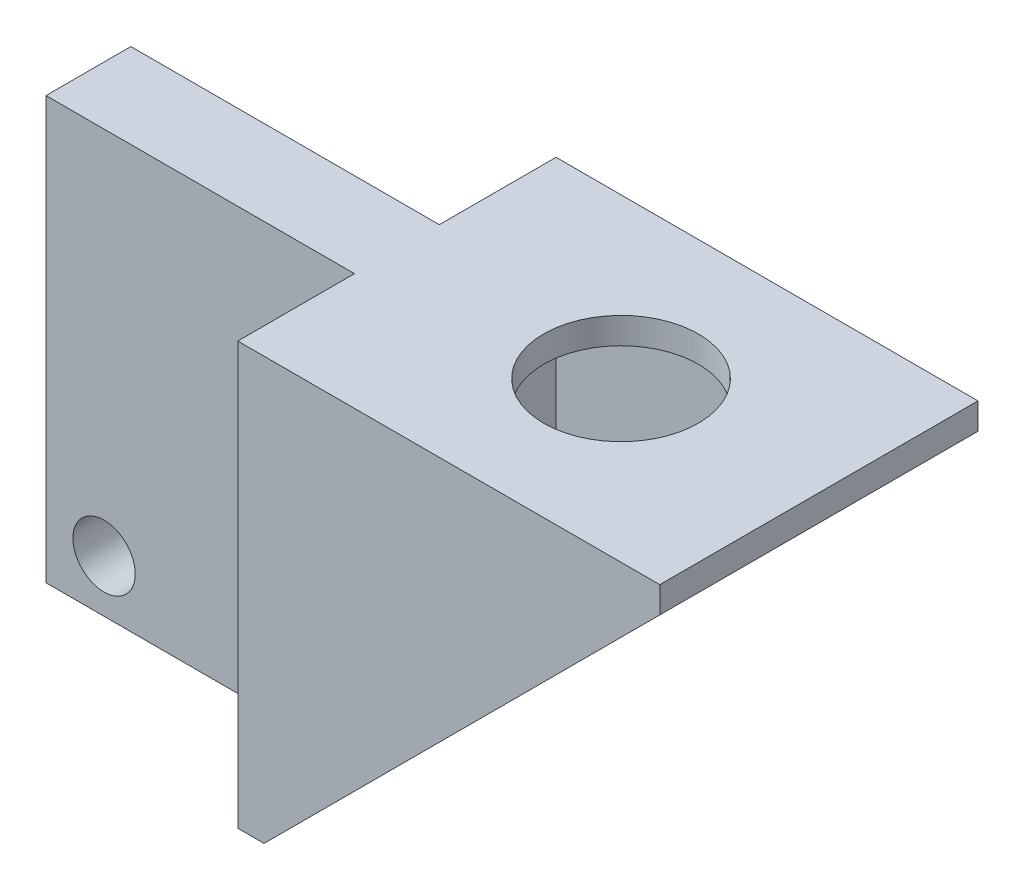
ISO-10303-21;
HEADER;
FILE_DESCRIPTION(('STEP AP214'),'2;1');
FILE_NAME('part.step','',(''),(''),'','','');
FILE_SCHEMA(('AUTOMOTIVE_DESIGN { 1 0 10303 214 1 1 1 1 }'));
ENDSEC;
DATA;
#1=APPLICATION_CONTEXT('core data for automotive mechanical design processes');
#2=APPLICATION_PROTOCOL_DEFINITION('international standard','automotive_design',2000,#1);
#3=PRODUCT_CONTEXT('',#1,'mechanical');
#4=PRODUCT('Part','Part','',(#3));
#5=PRODUCT_RELATED_PRODUCT_CATEGORY('part','',(#4));
#6=PRODUCT_DEFINITION_FORMATION('','',#4);
#7=PRODUCT_DEFINITION_CONTEXT('part definition',#1,'design');
#8=PRODUCT_DEFINITION('design','',#6,#7);
#9=PRODUCT_DEFINITION_SHAPE('','',#8);
#10=(LENGTH_UNIT() NAMED_UNIT(*) SI_UNIT(.MILLI.,.METRE.));
#11=(NAMED_UNIT(*) PLANE_ANGLE_UNIT() SI_UNIT($,.RADIAN.));
#12=(NAMED_UNIT(*) SI_UNIT($,.STERADIAN.) SOLID_ANGLE_UNIT());
#13=UNCERTAINTY_MEASURE_WITH_UNIT(LENGTH_MEASURE(1.E-05),#10,'distance_accuracy_value','');
#14=(GEOMETRIC_REPRESENTATION_CONTEXT(3) GLOBAL_UNCERTAINTY_ASSIGNED_CONTEXT((#13)) GLOBAL_UNIT_ASSIGNED_CONTEXT((#10,
#11,#12)) REPRESENTATION_CONTEXT('',''));
#15=CARTESIAN_POINT('',(0.,0.,0.));
#16=DIRECTION('',(0.,0.,1.));
#17=DIRECTION('',(1.,0.,0.));
#18=AXIS2_PLACEMENT_3D('',#15,#16,#17);
#19=CARTESIAN_POINT('',(-31.8262,0.,0.));
#20=DIRECTION('',(-1.,0.,0.));
#21=DIRECTION('',(0.,0.,1.));
#22=AXIS2_PLACEMENT_3D('',#19,#20,#21);
#23=PLANE('',#22);
#24=DIRECTION('',(0.,-1.,0.));
#25=VECTOR('',#24,1.);
#26=CARTESIAN_POINT('',(-31.8262,-29.845,-15.2015));
#27=LINE('',#26,#25);
#28=CARTESIAN_POINT('',(-31.8262,1.9812,-15.2015));
#29=VERTEX_POINT('',#28);
#30=CARTESIAN_POINT('',(-31.8262,-29.845,-15.2015));
#31=VERTEX_POINT('',#30);
#32=EDGE_CURVE('E156',#29,#31,#27,.T.);
#33=ORIENTED_EDGE('',*,*,#32,.F.);
#34=DIRECTION('',(0.,0.,-1.));
#35=VECTOR('',#34,1.);
#36=CARTESIAN_POINT('',(-31.8262,1.9812,0.));
#37=LINE('',#36,#35);
#38=CARTESIAN_POINT('',(-31.8262,1.9812,-24.003));
#39=VERTEX_POINT('',#38);
#40=EDGE_CURVE('E213',#29,#39,#37,.T.);
#41=ORIENTED_EDGE('',*,*,#40,.T.);
#42=DIRECTION('',(0.,-1.,0.));
#43=VECTOR('',#42,1.);
#44=CARTESIAN_POINT('',(-31.8262,1.9812,-24.003));
#45=LINE('',#44,#43);
#46=CARTESIAN_POINT('',(-31.8262,-29.845,-24.003));
#47=VERTEX_POINT('',#46);
#48=EDGE_CURVE('E212',#39,#47,#45,.T.);
#49=ORIENTED_EDGE('',*,*,#48,.T.);
#50=DIRECTION('',(0.,0.,1.));
#51=VECTOR('',#50,1.);
#52=CARTESIAN_POINT('',(-31.8262,-29.845,-24.003));
#53=LINE('',#52,#51);
#54=EDGE_CURVE('E69',#47,#31,#53,.T.);
#55=ORIENTED_EDGE('',*,*,#54,.T.);
#56=EDGE_LOOP('',(#33,#41,#49,#55));
#57=FACE_BOUND('',#56,.T.);
#58=ADVANCED_FACE('F43',(#57),#23,.T.);
#59=CARTESIAN_POINT('',(0.,1.9812,0.));
#60=DIRECTION('',(0.,1.,0.));
#61=DIRECTION('',(0.,0.,1.));
#62=AXIS2_PLACEMENT_3D('',#59,#60,#61);
#63=PLANE('',#62);
#64=DIRECTION('',(1.,0.,0.));
#65=VECTOR('',#64,1.);
#66=CARTESIAN_POINT('',(-29.845,1.9812,0.));
#67=LINE('',#66,#65);
#68=CARTESIAN_POINT('',(-31.8262,1.9812,0.));
#69=VERTEX_POINT('',#68);
#70=CARTESIAN_POINT('',(0.,1.9812,0.));
#71=VERTEX_POINT('',#70);
#72=EDGE_CURVE('E242',#69,#71,#67,.T.);
#73=ORIENTED_EDGE('',*,*,#72,.T.);
#74=DIRECTION('',(0.,0.,-1.));
#75=VECTOR('',#74,1.);
#76=CARTESIAN_POINT('',(0.,1.9812,0.));
#77=LINE('',#76,#75);
#78=CARTESIAN_POINT('',(0.,1.9812,-24.003));
#79=VERTEX_POINT('',#78);
#80=EDGE_CURVE('E246',#71,#79,#77,.T.);
#81=ORIENTED_EDGE('',*,*,#80,.T.);
#82=DIRECTION('',(-1.,0.,0.));
#83=VECTOR('',#82,1.);
#84=CARTESIAN_POINT('',(0.,1.9812,-24.003));
#85=LINE('',#84,#83);
#86=EDGE_CURVE('E250',#79,#39,#85,.T.);
#87=ORIENTED_EDGE('',*,*,#86,.T.);
#88=ORIENTED_EDGE('',*,*,#40,.F.);
#89=DIRECTION('',(1.,0.,0.));
#90=VECTOR('',#89,1.);
#91=CARTESIAN_POINT('',(-55.0926,1.9812,-15.2015));
#92=LINE('',#91,#90);
#93=CARTESIAN_POINT('',(-55.0926,1.9812,-15.2015));
#94=VERTEX_POINT('',#93);
#95=EDGE_CURVE('E170',#94,#29,#92,.T.);
#96=ORIENTED_EDGE('',*,*,#95,.F.);
#97=DIRECTION('',(0.,0.,-1.));
#98=VECTOR('',#97,1.);
#99=CARTESIAN_POINT('',(-55.0926,1.9812,-15.2015));
#100=LINE('',#99,#98);
#101=CARTESIAN_POINT('',(-55.0926,1.9812,-8.80149999999999));
#102=VERTEX_POINT('',#101);
#103=EDGE_CURVE('E145',#102,#94,#100,.T.);
#104=ORIENTED_EDGE('',*,*,#103,.F.);
#105=DIRECTION('',(1.,0.,0.));
#106=VECTOR('',#105,1.);
#107=CARTESIAN_POINT('',(-55.0926,1.9812,-8.80149999999999));
#108=LINE('',#107,#106);
#109=CARTESIAN_POINT('',(-31.8262,1.9812,-8.8015));
#110=VERTEX_POINT('',#109);
#111=EDGE_CURVE('E141',#102,#110,#108,.T.);
#112=ORIENTED_EDGE('',*,*,#111,.T.);
#113=EDGE_CURVE('E209',#69,#110,#37,.T.);
#114=ORIENTED_EDGE('',*,*,#113,.F.);
#115=EDGE_LOOP('',(#73,#81,#87,#88,#96,#104,#112,#114));
#116=FACE_BOUND('',#115,.T.);
#117=CARTESIAN_POINT('',(-14.9225,1.9812,-12.0015));
#118=DIRECTION('',(0.,1.,0.));
#119=DIRECTION('',(0.,0.,1.));
#120=AXIS2_PLACEMENT_3D('',#117,#118,#119);
#121=CIRCLE('',#120,5.83565);
#122=CARTESIAN_POINT('',(-14.9225,1.9812,-6.16585));
#123=VERTEX_POINT('',#122);
#124=EDGE_CURVE('E234',#123,#123,#121,.T.);
#125=ORIENTED_EDGE('',*,*,#124,.F.);
#126=EDGE_LOOP('',(#125));
#127=FACE_BOUND('',#126,.T.);
#128=ADVANCED_FACE('F297',(#116,#127),#63,.T.);
#129=CARTESIAN_POINT('',(0.,0.,0.));
#130=DIRECTION('',(0.,1.,0.));
#131=DIRECTION('',(0.,0.,1.));
#132=AXIS2_PLACEMENT_3D('',#129,#130,#131);
#133=PLANE('',#132);
#134=DIRECTION('',(0.,0.,1.));
#135=VECTOR('',#134,1.);
#136=CARTESIAN_POINT('',(-29.845,0.,-24.003));
#137=LINE('',#136,#135);
#138=CARTESIAN_POINT('',(-29.845,0.,-22.0218));
#139=VERTEX_POINT('',#138);
#140=CARTESIAN_POINT('',(-29.845,0.,-1.9812));
#141=VERTEX_POINT('',#140);
#142=EDGE_CURVE('E247',#139,#141,#137,.T.);
#143=ORIENTED_EDGE('',*,*,#142,.F.);
#144=DIRECTION('',(1.,0.,0.));
#145=VECTOR('',#144,1.);
#146=CARTESIAN_POINT('',(0.,0.,-22.0218));
#147=LINE('',#146,#145);
#148=CARTESIAN_POINT('',(0.,0.,-22.0218));
#149=VERTEX_POINT('',#148);
#150=EDGE_CURVE('E180',#139,#149,#147,.T.);
#151=ORIENTED_EDGE('',*,*,#150,.T.);
#152=DIRECTION('',(0.,0.,-1.));
#153=VECTOR('',#152,1.);
#154=CARTESIAN_POINT('',(0.,0.,0.));
#155=LINE('',#154,#153);
#156=CARTESIAN_POINT('',(0.,0.,-1.9812));
#157=VERTEX_POINT('',#156);
#158=EDGE_CURVE('E238',#157,#149,#155,.T.);
#159=ORIENTED_EDGE('',*,*,#158,.F.);
#160=DIRECTION('',(-1.,0.,0.));
#161=VECTOR('',#160,1.);
#162=CARTESIAN_POINT('',(-29.845,0.,-1.9812));
#163=LINE('',#162,#161);
#164=EDGE_CURVE('E193',#157,#141,#163,.T.);
#165=ORIENTED_EDGE('',*,*,#164,.T.);
#166=EDGE_LOOP('',(#143,#151,#159,#165));
#167=FACE_BOUND('',#166,.T.);
#168=CARTESIAN_POINT('',(-14.9225,0.,-12.0015));
#169=DIRECTION('',(0.,1.,0.));
#170=DIRECTION('',(0.,0.,1.));
#171=AXIS2_PLACEMENT_3D('',#168,#169,#170);
#172=CIRCLE('',#171,5.83565);
#173=CARTESIAN_POINT('',(-14.9225,0.,-6.16585));
#174=VERTEX_POINT('',#173);
#175=EDGE_CURVE('E233',#174,#174,#172,.T.);
#176=ORIENTED_EDGE('',*,*,#175,.T.);
#177=EDGE_LOOP('',(#176));
#178=FACE_BOUND('',#177,.T.);
#179=ADVANCED_FACE('F317',(#167,#178),#133,.F.);
#180=CARTESIAN_POINT('',(-29.845,1.9812,0.));
#181=DIRECTION('',(0.,0.,-1.));
#182=DIRECTION('',(-1.,0.,0.));
#183=AXIS2_PLACEMENT_3D('',#180,#181,#182);
#184=PLANE('',#183);
#185=DIRECTION('',(0.707106781186547,0.707106781186547,0.));
#186=VECTOR('',#185,1.);
#187=CARTESIAN_POINT('',(0.,0.,0.));
#188=LINE('',#187,#186);
#189=CARTESIAN_POINT('',(-29.845,-29.845,0.));
#190=VERTEX_POINT('',#189);
#191=CARTESIAN_POINT('',(0.,0.,0.));
#192=VERTEX_POINT('',#191);
#193=EDGE_CURVE('E188',#190,#192,#188,.T.);
#194=ORIENTED_EDGE('',*,*,#193,.T.);
#195=DIRECTION('',(0.,-1.,0.));
#196=VECTOR('',#195,1.);
#197=CARTESIAN_POINT('',(0.,1.9812,0.));
#198=LINE('',#197,#196);
#199=EDGE_CURVE('E11',#71,#192,#198,.T.);
#200=ORIENTED_EDGE('',*,*,#199,.F.);
#201=ORIENTED_EDGE('',*,*,#72,.F.);
#202=DIRECTION('',(0.,1.,0.));
#203=VECTOR('',#202,1.);
#204=CARTESIAN_POINT('',(-31.8262,-29.845,0.));
#205=LINE('',#204,#203);
#206=CARTESIAN_POINT('',(-31.8262,-29.845,0.));
#207=VERTEX_POINT('',#206);
#208=EDGE_CURVE('E218',#207,#69,#205,.T.);
#209=ORIENTED_EDGE('',*,*,#208,.F.);
#210=DIRECTION('',(1.,0.,0.));
#211=VECTOR('',#210,1.);
#212=CARTESIAN_POINT('',(-31.8262,-29.845,0.));
#213=LINE('',#212,#211);
#214=EDGE_CURVE('E222',#207,#190,#213,.T.);
#215=ORIENTED_EDGE('',*,*,#214,.T.);
#216=EDGE_LOOP('',(#194,#200,#201,#209,#215));
#217=FACE_BOUND('',#216,.T.);
#218=ADVANCED_FACE('F45',(#217),#184,.F.);
#219=CARTESIAN_POINT('',(0.,1.9812,0.));
#220=DIRECTION('',(-1.,0.,0.));
#221=DIRECTION('',(0.,0.,1.));
#222=AXIS2_PLACEMENT_3D('',#219,#220,#221);
#223=PLANE('',#222);
#224=EDGE_CURVE('E254',#192,#157,#155,.T.);
#225=ORIENTED_EDGE('',*,*,#224,.T.);
#226=ORIENTED_EDGE('',*,*,#158,.T.);
#227=DIRECTION('',(0.,0.,-1.));
#228=VECTOR('',#227,1.);
#229=CARTESIAN_POINT('',(0.,0.,-22.0218));
#230=LINE('',#229,#228);
#231=CARTESIAN_POINT('',(0.,0.,-24.003));
#232=VERTEX_POINT('',#231);
#233=EDGE_CURVE('E183',#149,#232,#230,.T.);
#234=ORIENTED_EDGE('',*,*,#233,.T.);
#235=DIRECTION('',(0.,-1.,0.));
#236=VECTOR('',#235,1.);
#237=CARTESIAN_POINT('',(0.,1.9812,-24.003));
#238=LINE('',#237,#236);
#239=EDGE_CURVE('E53',#79,#232,#238,.T.);
#240=ORIENTED_EDGE('',*,*,#239,.F.);
#241=ORIENTED_EDGE('',*,*,#80,.F.);
#242=ORIENTED_EDGE('',*,*,#199,.T.);
#243=EDGE_LOOP('',(#225,#226,#234,#240,#241,#242));
#244=FACE_BOUND('',#243,.T.);
#245=ADVANCED_FACE('F322',(#244),#223,.F.);
#246=CARTESIAN_POINT('',(0.,1.9812,-24.003));
#247=DIRECTION('',(0.,0.,1.));
#248=DIRECTION('',(1.,0.,0.));
#249=AXIS2_PLACEMENT_3D('',#246,#247,#248);
#250=PLANE('',#249);
#251=ORIENTED_EDGE('',*,*,#239,.T.);
#252=DIRECTION('',(-0.707106781186547,-0.707106781186547,0.));
#253=VECTOR('',#252,1.);
#254=CARTESIAN_POINT('',(-29.845,-29.845,-24.003));
#255=LINE('',#254,#253);
#256=CARTESIAN_POINT('',(-29.845,-29.845,-24.003));
#257=VERTEX_POINT('',#256);
#258=EDGE_CURVE('E163',#232,#257,#255,.T.);
#259=ORIENTED_EDGE('',*,*,#258,.T.);
#260=DIRECTION('',(1.,0.,0.));
#261=VECTOR('',#260,1.);
#262=CARTESIAN_POINT('',(-31.8262,-29.845,-24.003));
#263=LINE('',#262,#261);
#264=EDGE_CURVE('E229',#47,#257,#263,.T.);
#265=ORIENTED_EDGE('',*,*,#264,.F.);
#266=ORIENTED_EDGE('',*,*,#48,.F.);
#267=ORIENTED_EDGE('',*,*,#86,.F.);
#268=EDGE_LOOP('',(#251,#259,#265,#266,#267));
#269=FACE_BOUND('',#268,.T.);
#270=ADVANCED_FACE('F330',(#269),#250,.F.);
#271=CARTESIAN_POINT('',(-14.9225,1.9812,-12.0015));
#272=DIRECTION('',(0.,-1.,0.));
#273=DIRECTION('',(0.,0.,-1.));
#274=AXIS2_PLACEMENT_3D('',#271,#272,#273);
#275=CYLINDRICAL_SURFACE('',#274,5.83565);
#276=ORIENTED_EDGE('',*,*,#124,.T.);
#277=EDGE_LOOP('',(#276));
#278=FACE_BOUND('',#277,.T.);
#279=ORIENTED_EDGE('',*,*,#175,.F.);
#280=EDGE_LOOP('',(#279));
#281=FACE_BOUND('',#280,.T.);
#282=ADVANCED_FACE('F349',(#278,#281),#275,.F.);
#283=CARTESIAN_POINT('',(-29.845,0.,0.));
#284=DIRECTION('',(-1.,0.,0.));
#285=DIRECTION('',(0.,0.,1.));
#286=AXIS2_PLACEMENT_3D('',#283,#284,#285);
#287=PLANE('',#286);
#288=DIRECTION('',(0.,0.,1.));
#289=VECTOR('',#288,1.);
#290=CARTESIAN_POINT('',(-29.845,-29.845,-24.003));
#291=LINE('',#290,#289);
#292=CARTESIAN_POINT('',(-29.845,-29.845,-22.0218));
#293=VERTEX_POINT('',#292);
#294=CARTESIAN_POINT('',(-29.845,-29.845,-1.9812));
#295=VERTEX_POINT('',#294);
#296=EDGE_CURVE('E208',#293,#295,#291,.T.);
#297=ORIENTED_EDGE('',*,*,#296,.F.);
#298=DIRECTION('',(0.,1.,0.));
#299=VECTOR('',#298,1.);
#300=CARTESIAN_POINT('',(-29.845,0.,-22.0218));
#301=LINE('',#300,#299);
#302=EDGE_CURVE('E176',#293,#139,#301,.T.);
#303=ORIENTED_EDGE('',*,*,#302,.T.);
#304=ORIENTED_EDGE('',*,*,#142,.T.);
#305=DIRECTION('',(0.,-1.,0.));
#306=VECTOR('',#305,1.);
#307=CARTESIAN_POINT('',(-29.845,-29.845,-1.9812));
#308=LINE('',#307,#306);
#309=EDGE_CURVE('E197',#141,#295,#308,.T.);
#310=ORIENTED_EDGE('',*,*,#309,.T.);
#311=EDGE_LOOP('',(#297,#303,#304,#310));
#312=FACE_BOUND('',#311,.T.);
#313=ADVANCED_FACE('F313',(#312),#287,.F.);
#314=CARTESIAN_POINT('',(-31.8262,-29.845,-24.003));
#315=DIRECTION('',(0.,1.,0.));
#316=DIRECTION('',(0.,0.,1.));
#317=AXIS2_PLACEMENT_3D('',#314,#315,#316);
#318=PLANE('',#317);
#319=EDGE_CURVE('E223',#257,#293,#291,.T.);
#320=ORIENTED_EDGE('',*,*,#319,.T.);
#321=ORIENTED_EDGE('',*,*,#296,.T.);
#322=DIRECTION('',(0.,0.,1.));
#323=VECTOR('',#322,1.);
#324=CARTESIAN_POINT('',(-29.845,-29.845,-1.9812));
#325=LINE('',#324,#323);
#326=EDGE_CURVE('E201',#295,#190,#325,.T.);
#327=ORIENTED_EDGE('',*,*,#326,.T.);
#328=ORIENTED_EDGE('',*,*,#214,.F.);
#329=CARTESIAN_POINT('',(-31.8262,-29.845,-8.8015));
#330=VERTEX_POINT('',#329);
#331=EDGE_CURVE('E161',#330,#207,#53,.T.);
#332=ORIENTED_EDGE('',*,*,#331,.F.);
#333=DIRECTION('',(1.,0.,0.));
#334=VECTOR('',#333,1.);
#335=CARTESIAN_POINT('',(-55.0926,-29.845,-8.80149999999999));
#336=LINE('',#335,#334);
#337=CARTESIAN_POINT('',(-55.0926,-29.845,-8.80149999999999));
#338=VERTEX_POINT('',#337);
#339=EDGE_CURVE('E139',#338,#330,#336,.T.);
#340=ORIENTED_EDGE('',*,*,#339,.F.);
#341=DIRECTION('',(0.,0.,1.));
#342=VECTOR('',#341,1.);
#343=CARTESIAN_POINT('',(-55.0926,-29.845,-8.80149999999999));
#344=LINE('',#343,#342);
#345=CARTESIAN_POINT('',(-55.0926,-29.845,-15.2015));
#346=VERTEX_POINT('',#345);
#347=EDGE_CURVE('E146',#346,#338,#344,.T.);
#348=ORIENTED_EDGE('',*,*,#347,.F.);
#349=DIRECTION('',(1.,0.,0.));
#350=VECTOR('',#349,1.);
#351=CARTESIAN_POINT('',(-55.0926,-29.845,-15.2015));
#352=LINE('',#351,#350);
#353=EDGE_CURVE('E284',#346,#31,#352,.T.);
#354=ORIENTED_EDGE('',*,*,#353,.T.);
#355=ORIENTED_EDGE('',*,*,#54,.F.);
#356=ORIENTED_EDGE('',*,*,#264,.T.);
#357=EDGE_LOOP('',(#320,#321,#327,#328,#332,#340,#348,#354,#355,#356));
#358=FACE_BOUND('',#357,.T.);
#359=ADVANCED_FACE('F159',(#358),#318,.F.);
#360=DIRECTION('',(0.,1.,0.));
#361=VECTOR('',#360,1.);
#362=CARTESIAN_POINT('',(-31.8262,1.9812,-8.8015));
#363=LINE('',#362,#361);
#364=EDGE_CURVE('E61',#330,#110,#363,.T.);
#365=ORIENTED_EDGE('',*,*,#364,.F.);
#366=ORIENTED_EDGE('',*,*,#331,.T.);
#367=ORIENTED_EDGE('',*,*,#208,.T.);
#368=ORIENTED_EDGE('',*,*,#113,.T.);
#369=EDGE_LOOP('',(#365,#366,#367,#368));
#370=FACE_BOUND('',#369,.T.);
#371=ADVANCED_FACE('F327',(#370),#23,.T.);
#372=CARTESIAN_POINT('',(0.,0.,-1.9812));
#373=DIRECTION('',(0.707106781186547,-0.707106781186547,0.));
#374=DIRECTION('',(0.707106781186548,0.707106781186548,0.));
#375=AXIS2_PLACEMENT_3D('',#372,#373,#374);
#376=PLANE('',#375);
#377=ORIENTED_EDGE('',*,*,#193,.F.);
#378=ORIENTED_EDGE('',*,*,#326,.F.);
#379=DIRECTION('',(0.707106781186547,0.707106781186547,0.));
#380=VECTOR('',#379,1.);
#381=CARTESIAN_POINT('',(0.,0.,-1.9812));
#382=LINE('',#381,#380);
#383=EDGE_CURVE('E189',#295,#157,#382,.T.);
#384=ORIENTED_EDGE('',*,*,#383,.T.);
#385=ORIENTED_EDGE('',*,*,#224,.F.);
#386=EDGE_LOOP('',(#377,#378,#384,#385));
#387=FACE_BOUND('',#386,.T.);
#388=ADVANCED_FACE('F308',(#387),#376,.T.);
#389=CARTESIAN_POINT('',(0.,0.,-1.9812));
#390=DIRECTION('',(0.,0.,-1.));
#391=DIRECTION('',(-1.,0.,0.));
#392=AXIS2_PLACEMENT_3D('',#389,#390,#391);
#393=PLANE('',#392);
#394=ORIENTED_EDGE('',*,*,#383,.F.);
#395=ORIENTED_EDGE('',*,*,#309,.F.);
#396=ORIENTED_EDGE('',*,*,#164,.F.);
#397=EDGE_LOOP('',(#394,#395,#396));
#398=FACE_BOUND('',#397,.T.);
#399=ADVANCED_FACE('F312',(#398),#393,.T.);
#400=CARTESIAN_POINT('',(-29.845,-29.845,-22.0218));
#401=DIRECTION('',(0.707106781186547,-0.707106781186547,0.));
#402=DIRECTION('',(0.707106781186548,0.707106781186548,0.));
#403=AXIS2_PLACEMENT_3D('',#400,#401,#402);
#404=PLANE('',#403);
#405=ORIENTED_EDGE('',*,*,#258,.F.);
#406=ORIENTED_EDGE('',*,*,#233,.F.);
#407=DIRECTION('',(-0.707106781186547,-0.707106781186547,0.));
#408=VECTOR('',#407,1.);
#409=CARTESIAN_POINT('',(-29.845,-29.845,-22.0218));
#410=LINE('',#409,#408);
#411=EDGE_CURVE('E168',#149,#293,#410,.T.);
#412=ORIENTED_EDGE('',*,*,#411,.T.);
#413=ORIENTED_EDGE('',*,*,#319,.F.);
#414=EDGE_LOOP('',(#405,#406,#412,#413));
#415=FACE_BOUND('',#414,.T.);
#416=ADVANCED_FACE('F457',(#415),#404,.T.);
#417=CARTESIAN_POINT('',(0.,0.,-22.0218));
#418=DIRECTION('',(0.,0.,1.));
#419=DIRECTION('',(1.,0.,0.));
#420=AXIS2_PLACEMENT_3D('',#417,#418,#419);
#421=PLANE('',#420);
#422=ORIENTED_EDGE('',*,*,#411,.F.);
#423=ORIENTED_EDGE('',*,*,#150,.F.);
#424=ORIENTED_EDGE('',*,*,#302,.F.);
#425=EDGE_LOOP('',(#422,#423,#424));
#426=FACE_BOUND('',#425,.T.);
#427=ADVANCED_FACE('F412',(#426),#421,.T.);
#428=CARTESIAN_POINT('',(-55.0926,1.9812,-8.80149999999999));
#429=DIRECTION('',(0.,0.,-1.));
#430=DIRECTION('',(0.,1.,0.));
#431=AXIS2_PLACEMENT_3D('',#428,#429,#430);
#432=PLANE('',#431);
#433=CARTESIAN_POINT('',(-50.710600001,-25.908,-8.8015));
#434=DIRECTION('',(0.,0.,1.));
#435=DIRECTION('',(1.,0.,0.));
#436=AXIS2_PLACEMENT_3D('',#433,#434,#435);
#437=CIRCLE('',#436,2.349999999);
#438=CARTESIAN_POINT('',(-48.360600002,-25.908,-8.8015));
#439=VERTEX_POINT('',#438);
#440=EDGE_CURVE('E265',#439,#439,#437,.T.);
#441=ORIENTED_EDGE('',*,*,#440,.F.);
#442=EDGE_LOOP('',(#441));
#443=FACE_BOUND('',#442,.T.);
#444=CARTESIAN_POINT('',(-36.260599945,-25.908,-8.8015));
#445=DIRECTION('',(0.,0.,1.));
#446=DIRECTION('',(1.,0.,0.));
#447=AXIS2_PLACEMENT_3D('',#444,#445,#446);
#448=CIRCLE('',#447,2.349999999);
#449=CARTESIAN_POINT('',(-33.910599946,-25.908,-8.8015));
#450=VERTEX_POINT('',#449);
#451=EDGE_CURVE('E272',#450,#450,#448,.T.);
#452=ORIENTED_EDGE('',*,*,#451,.F.);
#453=EDGE_LOOP('',(#452));
#454=FACE_BOUND('',#453,.T.);
#455=ORIENTED_EDGE('',*,*,#364,.T.);
#456=ORIENTED_EDGE('',*,*,#111,.F.);
#457=DIRECTION('',(0.,1.,0.));
#458=VECTOR('',#457,1.);
#459=CARTESIAN_POINT('',(-55.0926,1.9812,-8.80149999999999));
#460=LINE('',#459,#458);
#461=EDGE_CURVE('E135',#338,#102,#460,.T.);
#462=ORIENTED_EDGE('',*,*,#461,.F.);
#463=ORIENTED_EDGE('',*,*,#339,.T.);
#464=EDGE_LOOP('',(#455,#456,#462,#463));
#465=FACE_BOUND('',#464,.T.);
#466=ADVANCED_FACE('F137',(#443,#454,#465),#432,.F.);
#467=CARTESIAN_POINT('',(-55.0926,-29.845,-15.2015));
#468=DIRECTION('',(0.,0.,1.));
#469=DIRECTION('',(0.,-1.,0.));
#470=AXIS2_PLACEMENT_3D('',#467,#468,#469);
#471=PLANE('',#470);
#472=CARTESIAN_POINT('',(-50.710600001,-25.908,-15.2015));
#473=DIRECTION('',(0.,0.,1.));
#474=DIRECTION('',(0.,-1.,0.));
#475=AXIS2_PLACEMENT_3D('',#472,#473,#474);
#476=CIRCLE('',#475,2.349999999);
#477=CARTESIAN_POINT('',(-50.710600001,-28.257999999,-15.2015));
#478=VERTEX_POINT('',#477);
#479=EDGE_CURVE('E47',#478,#478,#476,.T.);
#480=ORIENTED_EDGE('',*,*,#479,.T.);
#481=EDGE_LOOP('',(#480));
#482=FACE_BOUND('',#481,.T.);
#483=CARTESIAN_POINT('',(-36.260599945,-25.908,-15.2015));
#484=DIRECTION('',(0.,0.,1.));
#485=DIRECTION('',(0.,-1.,0.));
#486=AXIS2_PLACEMENT_3D('',#483,#484,#485);
#487=CIRCLE('',#486,2.349999999);
#488=CARTESIAN_POINT('',(-36.260599945,-28.257999999,-15.2015));
#489=VERTEX_POINT('',#488);
#490=EDGE_CURVE('E262',#489,#489,#487,.T.);
#491=ORIENTED_EDGE('',*,*,#490,.T.);
#492=EDGE_LOOP('',(#491));
#493=FACE_BOUND('',#492,.T.);
#494=ORIENTED_EDGE('',*,*,#32,.T.);
#495=ORIENTED_EDGE('',*,*,#353,.F.);
#496=DIRECTION('',(0.,-1.,0.));
#497=VECTOR('',#496,1.);
#498=CARTESIAN_POINT('',(-55.0926,-29.845,-15.2015));
#499=LINE('',#498,#497);
#500=EDGE_CURVE('E151',#94,#346,#499,.T.);
#501=ORIENTED_EDGE('',*,*,#500,.F.);
#502=ORIENTED_EDGE('',*,*,#95,.T.);
#503=EDGE_LOOP('',(#494,#495,#501,#502));
#504=FACE_BOUND('',#503,.T.);
#505=ADVANCED_FACE('F294',(#482,#493,#504),#471,.F.);
#506=CARTESIAN_POINT('',(-55.0926,0.,0.));
#507=DIRECTION('',(1.,0.,0.));
#508=DIRECTION('',(0.,0.,-1.));
#509=AXIS2_PLACEMENT_3D('',#506,#507,#508);
#510=PLANE('',#509);
#511=ORIENTED_EDGE('',*,*,#347,.T.);
#512=ORIENTED_EDGE('',*,*,#461,.T.);
#513=ORIENTED_EDGE('',*,*,#103,.T.);
#514=ORIENTED_EDGE('',*,*,#500,.T.);
#515=EDGE_LOOP('',(#511,#512,#513,#514));
#516=FACE_BOUND('',#515,.T.);
#517=ADVANCED_FACE('F149',(#516),#510,.F.);
#518=CARTESIAN_POINT('',(-36.260599945,-25.908,-24.003));
#519=DIRECTION('',(0.,0.,1.));
#520=DIRECTION('',(1.,0.,0.));
#521=AXIS2_PLACEMENT_3D('',#518,#519,#520);
#522=CYLINDRICAL_SURFACE('',#521,2.349999999);
#523=ORIENTED_EDGE('',*,*,#451,.T.);
#524=EDGE_LOOP('',(#523));
#525=FACE_BOUND('',#524,.T.);
#526=ORIENTED_EDGE('',*,*,#490,.F.);
#527=EDGE_LOOP('',(#526));
#528=FACE_BOUND('',#527,.T.);
#529=ADVANCED_FACE('F399',(#525,#528),#522,.F.);
#530=CARTESIAN_POINT('',(-50.710600001,-25.908,-24.003));
#531=DIRECTION('',(0.,0.,1.));
#532=DIRECTION('',(1.,0.,0.));
#533=AXIS2_PLACEMENT_3D('',#530,#531,#532);
#534=CYLINDRICAL_SURFACE('',#533,2.349999999);
#535=ORIENTED_EDGE('',*,*,#440,.T.);
#536=EDGE_LOOP('',(#535));
#537=FACE_BOUND('',#536,.T.);
#538=ORIENTED_EDGE('',*,*,#479,.F.);
#539=EDGE_LOOP('',(#538));
#540=FACE_BOUND('',#539,.T.);
#541=ADVANCED_FACE('F430',(#537,#540),#534,.F.);
#542=CLOSED_SHELL('',(#58,#128,#179,#218,#245,#270,#282,#313,#359,#371,#388,#399,#416,#427,#466,
#505,#517,#529,#541));
#543=MANIFOLD_SOLID_BREP('B2',#542);
#544=ADVANCED_BREP_SHAPE_REPRESENTATION('',(#18,#543),#14);
#545=SHAPE_DEFINITION_REPRESENTATION(#9,#544);
ENDSEC;
END-ISO-10303-21;
